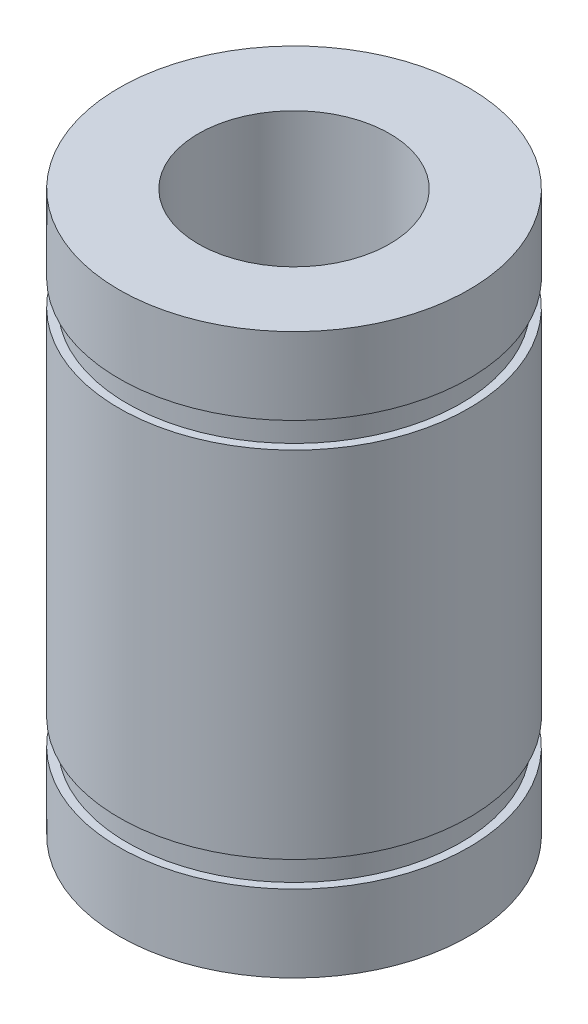
ISO-10303-21;
HEADER;
FILE_DESCRIPTION(('STEP AP214'),'2;1');
FILE_NAME('part.step','',(''),(''),'','','');
FILE_SCHEMA(('AUTOMOTIVE_DESIGN { 1 0 10303 214 1 1 1 1 }'));
ENDSEC;
DATA;
#1=APPLICATION_CONTEXT('core data for automotive mechanical design processes');
#2=APPLICATION_PROTOCOL_DEFINITION('international standard','automotive_design',2000,#1);
#3=PRODUCT_CONTEXT('',#1,'mechanical');
#4=PRODUCT('Part','Part','',(#3));
#5=PRODUCT_RELATED_PRODUCT_CATEGORY('part','',(#4));
#6=PRODUCT_DEFINITION_FORMATION('','',#4);
#7=PRODUCT_DEFINITION_CONTEXT('part definition',#1,'design');
#8=PRODUCT_DEFINITION('design','',#6,#7);
#9=PRODUCT_DEFINITION_SHAPE('','',#8);
#10=(LENGTH_UNIT() NAMED_UNIT(*) SI_UNIT(.MILLI.,.METRE.));
#11=(NAMED_UNIT(*) PLANE_ANGLE_UNIT() SI_UNIT($,.RADIAN.));
#12=(NAMED_UNIT(*) SI_UNIT($,.STERADIAN.) SOLID_ANGLE_UNIT());
#13=UNCERTAINTY_MEASURE_WITH_UNIT(LENGTH_MEASURE(1.E-05),#10,'distance_accuracy_value','');
#14=(GEOMETRIC_REPRESENTATION_CONTEXT(3) GLOBAL_UNCERTAINTY_ASSIGNED_CONTEXT((#13)) GLOBAL_UNIT_ASSIGNED_CONTEXT((#10,
#11,#12)) REPRESENTATION_CONTEXT('',''));
#15=CARTESIAN_POINT('',(0.,0.,0.));
#16=DIRECTION('',(0.,0.,1.));
#17=DIRECTION('',(1.,0.,0.));
#18=AXIS2_PLACEMENT_3D('',#15,#16,#17);
#19=CARTESIAN_POINT('',(0.,24.,0.));
#20=DIRECTION('',(0.,-1.,0.));
#21=DIRECTION('',(0.,0.,-1.));
#22=AXIS2_PLACEMENT_3D('',#19,#20,#21);
#23=CYLINDRICAL_SURFACE('',#22,7.5);
#24=CARTESIAN_POINT('',(0.,0.,0.));
#25=DIRECTION('',(0.,1.,0.));
#26=DIRECTION('',(0.,0.,1.));
#27=AXIS2_PLACEMENT_3D('',#24,#25,#26);
#28=CIRCLE('',#27,7.5);
#29=CARTESIAN_POINT('',(0.,0.,7.5));
#30=VERTEX_POINT('',#29);
#31=EDGE_CURVE('E35',#30,#30,#28,.T.);
#32=ORIENTED_EDGE('',*,*,#31,.T.);
#33=EDGE_LOOP('',(#32));
#34=FACE_BOUND('',#33,.T.);
#35=CARTESIAN_POINT('',(0.,3.3,0.));
#36=DIRECTION('',(0.,-1.,0.));
#37=DIRECTION('',(0.,0.,-1.));
#38=AXIS2_PLACEMENT_3D('',#35,#36,#37);
#39=CIRCLE('',#38,7.5);
#40=CARTESIAN_POINT('',(0.,3.3,-7.5));
#41=VERTEX_POINT('',#40);
#42=EDGE_CURVE('E64',#41,#41,#39,.T.);
#43=ORIENTED_EDGE('',*,*,#42,.T.);
#44=EDGE_LOOP('',(#43));
#45=FACE_BOUND('',#44,.T.);
#46=ADVANCED_FACE('F32',(#34,#45),#23,.T.);
#47=CARTESIAN_POINT('',(0.,19.6,0.));
#48=DIRECTION('',(0.,-1.,0.));
#49=DIRECTION('',(0.,0.,-1.));
#50=AXIS2_PLACEMENT_3D('',#47,#48,#49);
#51=CIRCLE('',#50,7.5);
#52=CARTESIAN_POINT('',(0.,19.6,-7.5));
#53=VERTEX_POINT('',#52);
#54=EDGE_CURVE('E47',#53,#53,#51,.T.);
#55=ORIENTED_EDGE('',*,*,#54,.T.);
#56=EDGE_LOOP('',(#55));
#57=FACE_BOUND('',#56,.T.);
#58=CARTESIAN_POINT('',(0.,4.4,0.));
#59=DIRECTION('',(0.,-1.,0.));
#60=DIRECTION('',(0.,0.,-1.));
#61=AXIS2_PLACEMENT_3D('',#58,#59,#60);
#62=CIRCLE('',#61,7.5);
#63=CARTESIAN_POINT('',(0.,4.4,-7.5));
#64=VERTEX_POINT('',#63);
#65=EDGE_CURVE('E67',#64,#64,#62,.T.);
#66=ORIENTED_EDGE('',*,*,#65,.F.);
#67=EDGE_LOOP('',(#66));
#68=FACE_BOUND('',#67,.T.);
#69=ADVANCED_FACE('F88',(#57,#68),#23,.T.);
#70=CARTESIAN_POINT('',(0.,24.,0.));
#71=DIRECTION('',(0.,1.,0.));
#72=DIRECTION('',(0.,0.,1.));
#73=AXIS2_PLACEMENT_3D('',#70,#71,#72);
#74=CIRCLE('',#73,7.5);
#75=CARTESIAN_POINT('',(0.,24.,7.5));
#76=VERTEX_POINT('',#75);
#77=EDGE_CURVE('E10',#76,#76,#74,.T.);
#78=ORIENTED_EDGE('',*,*,#77,.F.);
#79=EDGE_LOOP('',(#78));
#80=FACE_BOUND('',#79,.T.);
#81=CARTESIAN_POINT('',(0.,20.7,0.));
#82=DIRECTION('',(0.,-1.,0.));
#83=DIRECTION('',(0.,0.,-1.));
#84=AXIS2_PLACEMENT_3D('',#81,#82,#83);
#85=CIRCLE('',#84,7.5);
#86=CARTESIAN_POINT('',(0.,20.7,-7.5));
#87=VERTEX_POINT('',#86);
#88=EDGE_CURVE('E58',#87,#87,#85,.T.);
#89=ORIENTED_EDGE('',*,*,#88,.F.);
#90=EDGE_LOOP('',(#89));
#91=FACE_BOUND('',#90,.T.);
#92=ADVANCED_FACE('F90',(#80,#91),#23,.T.);
#93=CARTESIAN_POINT('',(0.,24.,0.));
#94=DIRECTION('',(0.,1.,0.));
#95=DIRECTION('',(0.,0.,1.));
#96=AXIS2_PLACEMENT_3D('',#93,#94,#95);
#97=PLANE('',#96);
#98=ORIENTED_EDGE('',*,*,#77,.T.);
#99=EDGE_LOOP('',(#98));
#100=FACE_BOUND('',#99,.T.);
#101=CARTESIAN_POINT('',(0.,24.,0.));
#102=DIRECTION('',(0.,1.,0.));
#103=DIRECTION('',(0.,0.,1.));
#104=AXIS2_PLACEMENT_3D('',#101,#102,#103);
#105=CIRCLE('',#104,4.1);
#106=CARTESIAN_POINT('',(0.,24.,4.1));
#107=VERTEX_POINT('',#106);
#108=EDGE_CURVE('E42',#107,#107,#105,.T.);
#109=ORIENTED_EDGE('',*,*,#108,.F.);
#110=EDGE_LOOP('',(#109));
#111=FACE_BOUND('',#110,.T.);
#112=ADVANCED_FACE('F97',(#100,#111),#97,.T.);
#113=CARTESIAN_POINT('',(0.,0.,0.));
#114=DIRECTION('',(0.,1.,0.));
#115=DIRECTION('',(0.,0.,1.));
#116=AXIS2_PLACEMENT_3D('',#113,#114,#115);
#117=PLANE('',#116);
#118=ORIENTED_EDGE('',*,*,#31,.F.);
#119=EDGE_LOOP('',(#118));
#120=FACE_BOUND('',#119,.T.);
#121=CARTESIAN_POINT('',(0.,0.,0.));
#122=DIRECTION('',(0.,1.,0.));
#123=DIRECTION('',(0.,0.,1.));
#124=AXIS2_PLACEMENT_3D('',#121,#122,#123);
#125=CIRCLE('',#124,4.1);
#126=CARTESIAN_POINT('',(0.,0.,4.1));
#127=VERTEX_POINT('',#126);
#128=EDGE_CURVE('E44',#127,#127,#125,.T.);
#129=ORIENTED_EDGE('',*,*,#128,.T.);
#130=EDGE_LOOP('',(#129));
#131=FACE_BOUND('',#130,.T.);
#132=ADVANCED_FACE('F102',(#120,#131),#117,.F.);
#133=CARTESIAN_POINT('',(0.,24.,0.));
#134=DIRECTION('',(0.,-1.,0.));
#135=DIRECTION('',(0.,0.,-1.));
#136=AXIS2_PLACEMENT_3D('',#133,#134,#135);
#137=CYLINDRICAL_SURFACE('',#136,4.1);
#138=ORIENTED_EDGE('',*,*,#108,.T.);
#139=EDGE_LOOP('',(#138));
#140=FACE_BOUND('',#139,.T.);
#141=ORIENTED_EDGE('',*,*,#128,.F.);
#142=EDGE_LOOP('',(#141));
#143=FACE_BOUND('',#142,.T.);
#144=ADVANCED_FACE('F122',(#140,#143),#137,.F.);
#145=CARTESIAN_POINT('',(-7.5,19.6,0.));
#146=DIRECTION('',(0.,1.,0.));
#147=DIRECTION('',(0.,0.,1.));
#148=AXIS2_PLACEMENT_3D('',#145,#146,#147);
#149=PLANE('',#148);
#150=CARTESIAN_POINT('',(0.,19.6,0.));
#151=DIRECTION('',(0.,-1.,0.));
#152=DIRECTION('',(0.,0.,-1.));
#153=AXIS2_PLACEMENT_3D('',#150,#151,#152);
#154=CIRCLE('',#153,7.15);
#155=CARTESIAN_POINT('',(0.,19.6,-7.15));
#156=VERTEX_POINT('',#155);
#157=EDGE_CURVE('E52',#156,#156,#154,.T.);
#158=ORIENTED_EDGE('',*,*,#157,.T.);
#159=EDGE_LOOP('',(#158));
#160=FACE_BOUND('',#159,.T.);
#161=ORIENTED_EDGE('',*,*,#54,.F.);
#162=EDGE_LOOP('',(#161));
#163=FACE_BOUND('',#162,.T.);
#164=ADVANCED_FACE('F116',(#160,#163),#149,.T.);
#165=CARTESIAN_POINT('',(0.,0.,0.));
#166=DIRECTION('',(0.,-1.,0.));
#167=DIRECTION('',(0.,0.,-1.));
#168=AXIS2_PLACEMENT_3D('',#165,#166,#167);
#169=CYLINDRICAL_SURFACE('',#168,7.15);
#170=CARTESIAN_POINT('',(0.,20.7,0.));
#171=DIRECTION('',(0.,-1.,0.));
#172=DIRECTION('',(0.,0.,-1.));
#173=AXIS2_PLACEMENT_3D('',#170,#171,#172);
#174=CIRCLE('',#173,7.15);
#175=CARTESIAN_POINT('',(0.,20.7,-7.15));
#176=VERTEX_POINT('',#175);
#177=EDGE_CURVE('E55',#176,#176,#174,.T.);
#178=ORIENTED_EDGE('',*,*,#177,.T.);
#179=EDGE_LOOP('',(#178));
#180=FACE_BOUND('',#179,.T.);
#181=ORIENTED_EDGE('',*,*,#157,.F.);
#182=EDGE_LOOP('',(#181));
#183=FACE_BOUND('',#182,.T.);
#184=ADVANCED_FACE('F110',(#180,#183),#169,.T.);
#185=CARTESIAN_POINT('',(-7.5,20.7,0.));
#186=DIRECTION('',(0.,-1.,0.));
#187=DIRECTION('',(0.,0.,-1.));
#188=AXIS2_PLACEMENT_3D('',#185,#186,#187);
#189=PLANE('',#188);
#190=ORIENTED_EDGE('',*,*,#88,.T.);
#191=EDGE_LOOP('',(#190));
#192=FACE_BOUND('',#191,.T.);
#193=ORIENTED_EDGE('',*,*,#177,.F.);
#194=EDGE_LOOP('',(#193));
#195=FACE_BOUND('',#194,.T.);
#196=ADVANCED_FACE('F107',(#192,#195),#189,.T.);
#197=CARTESIAN_POINT('',(0.,0.,0.));
#198=DIRECTION('',(0.,-1.,0.));
#199=DIRECTION('',(0.,0.,-1.));
#200=AXIS2_PLACEMENT_3D('',#197,#198,#199);
#201=CYLINDRICAL_SURFACE('',#200,7.15);
#202=CARTESIAN_POINT('',(0.,4.4,0.));
#203=DIRECTION('',(0.,-1.,0.));
#204=DIRECTION('',(0.,0.,-1.));
#205=AXIS2_PLACEMENT_3D('',#202,#203,#204);
#206=CIRCLE('',#205,7.15);
#207=CARTESIAN_POINT('',(0.,4.4,-7.15));
#208=VERTEX_POINT('',#207);
#209=EDGE_CURVE('E70',#208,#208,#206,.T.);
#210=ORIENTED_EDGE('',*,*,#209,.T.);
#211=EDGE_LOOP('',(#210));
#212=FACE_BOUND('',#211,.T.);
#213=CARTESIAN_POINT('',(0.,3.3,0.));
#214=DIRECTION('',(0.,-1.,0.));
#215=DIRECTION('',(0.,0.,-1.));
#216=AXIS2_PLACEMENT_3D('',#213,#214,#215);
#217=CIRCLE('',#216,7.15);
#218=CARTESIAN_POINT('',(0.,3.3,-7.15));
#219=VERTEX_POINT('',#218);
#220=EDGE_CURVE('E61',#219,#219,#217,.T.);
#221=ORIENTED_EDGE('',*,*,#220,.F.);
#222=EDGE_LOOP('',(#221));
#223=FACE_BOUND('',#222,.T.);
#224=ADVANCED_FACE('F74',(#212,#223),#201,.T.);
#225=CARTESIAN_POINT('',(-7.5,3.3,0.));
#226=DIRECTION('',(0.,1.,0.));
#227=DIRECTION('',(0.,0.,1.));
#228=AXIS2_PLACEMENT_3D('',#225,#226,#227);
#229=PLANE('',#228);
#230=ORIENTED_EDGE('',*,*,#220,.T.);
#231=EDGE_LOOP('',(#230));
#232=FACE_BOUND('',#231,.T.);
#233=ORIENTED_EDGE('',*,*,#42,.F.);
#234=EDGE_LOOP('',(#233));
#235=FACE_BOUND('',#234,.T.);
#236=ADVANCED_FACE('F79',(#232,#235),#229,.T.);
#237=CARTESIAN_POINT('',(-7.5,4.4,0.));
#238=DIRECTION('',(0.,-1.,0.));
#239=DIRECTION('',(0.,0.,-1.));
#240=AXIS2_PLACEMENT_3D('',#237,#238,#239);
#241=PLANE('',#240);
#242=ORIENTED_EDGE('',*,*,#65,.T.);
#243=EDGE_LOOP('',(#242));
#244=FACE_BOUND('',#243,.T.);
#245=ORIENTED_EDGE('',*,*,#209,.F.);
#246=EDGE_LOOP('',(#245));
#247=FACE_BOUND('',#246,.T.);
#248=ADVANCED_FACE('F77',(#244,#247),#241,.T.);
#249=CLOSED_SHELL('',(#46,#69,#92,#112,#132,#144,#164,#184,#196,#224,#236,#248));
#250=MANIFOLD_SOLID_BREP('B2',#249);
#251=ADVANCED_BREP_SHAPE_REPRESENTATION('',(#18,#250),#14);
#252=SHAPE_DEFINITION_REPRESENTATION(#9,#251);
ENDSEC;
END-ISO-10303-21;
